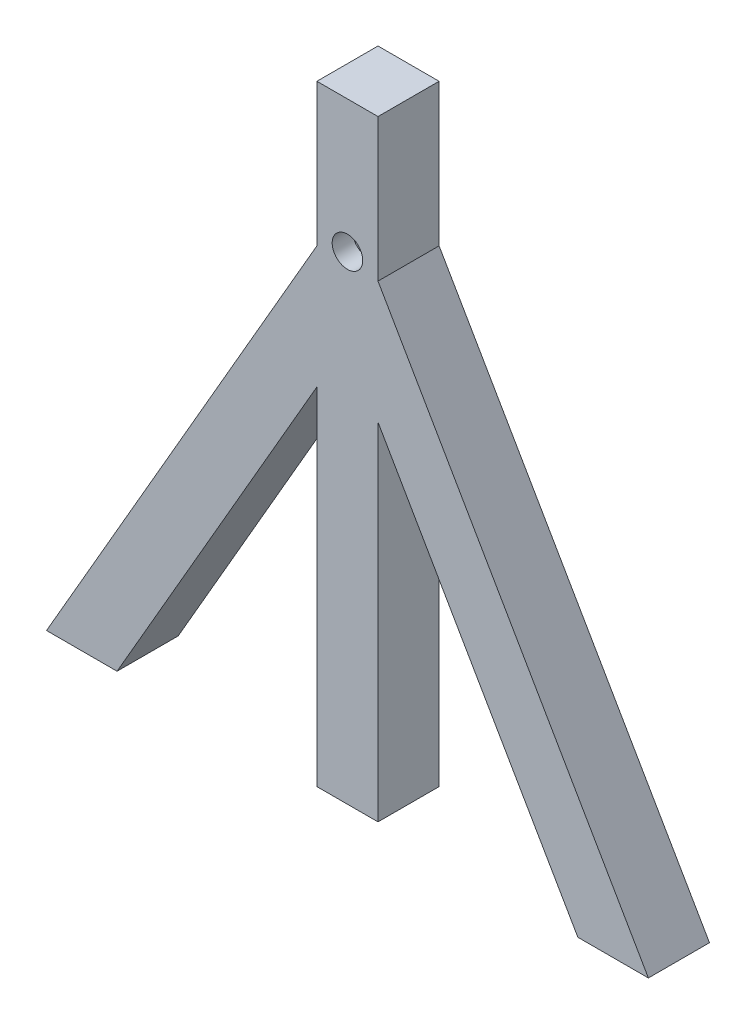
ISO-10303-21;
HEADER;
FILE_DESCRIPTION(('STEP AP214'),'2;1');
FILE_NAME('part.step','',(''),(''),'','','');
FILE_SCHEMA(('AUTOMOTIVE_DESIGN { 1 0 10303 214 1 1 1 1 }'));
ENDSEC;
DATA;
#1=APPLICATION_CONTEXT('core data for automotive mechanical design processes');
#2=APPLICATION_PROTOCOL_DEFINITION('international standard','automotive_design',2000,#1);
#3=PRODUCT_CONTEXT('',#1,'mechanical');
#4=PRODUCT('Part','Part','',(#3));
#5=PRODUCT_RELATED_PRODUCT_CATEGORY('part','',(#4));
#6=PRODUCT_DEFINITION_FORMATION('','',#4);
#7=PRODUCT_DEFINITION_CONTEXT('part definition',#1,'design');
#8=PRODUCT_DEFINITION('design','',#6,#7);
#9=PRODUCT_DEFINITION_SHAPE('','',#8);
#10=(LENGTH_UNIT() NAMED_UNIT(*) SI_UNIT(.MILLI.,.METRE.));
#11=(NAMED_UNIT(*) PLANE_ANGLE_UNIT() SI_UNIT($,.RADIAN.));
#12=(NAMED_UNIT(*) SI_UNIT($,.STERADIAN.) SOLID_ANGLE_UNIT());
#13=UNCERTAINTY_MEASURE_WITH_UNIT(LENGTH_MEASURE(1.E-05),#10,'distance_accuracy_value','');
#14=(GEOMETRIC_REPRESENTATION_CONTEXT(3) GLOBAL_UNCERTAINTY_ASSIGNED_CONTEXT((#13)) GLOBAL_UNIT_ASSIGNED_CONTEXT((#10,
#11,#12)) REPRESENTATION_CONTEXT('',''));
#15=CARTESIAN_POINT('',(0.,0.,0.));
#16=DIRECTION('',(0.,0.,1.));
#17=DIRECTION('',(1.,0.,0.));
#18=AXIS2_PLACEMENT_3D('',#15,#16,#17);
#19=CARTESIAN_POINT('',(14.9999999999999,80.0000000000009,30.));
#20=DIRECTION('',(-1.,0.,0.));
#21=DIRECTION('',(0.,-1.,0.));
#22=AXIS2_PLACEMENT_3D('',#19,#20,#21);
#23=PLANE('',#22);
#24=DIRECTION('',(0.,1.,0.));
#25=VECTOR('',#24,1.);
#26=CARTESIAN_POINT('',(14.9999999999999,80.0000000000009,0.));
#27=LINE('',#26,#25);
#28=CARTESIAN_POINT('',(14.9999999999999,80.0000000000009,0.));
#29=VERTEX_POINT('',#28);
#30=CARTESIAN_POINT('',(15.,150.,0.));
#31=VERTEX_POINT('',#30);
#32=EDGE_CURVE('E152',#29,#31,#27,.T.);
#33=ORIENTED_EDGE('',*,*,#32,.T.);
#34=DIRECTION('',(0.,0.,-1.));
#35=VECTOR('',#34,1.);
#36=CARTESIAN_POINT('',(15.,150.,30.));
#37=LINE('',#36,#35);
#38=CARTESIAN_POINT('',(15.,150.,30.));
#39=VERTEX_POINT('',#38);
#40=EDGE_CURVE('E11',#39,#31,#37,.T.);
#41=ORIENTED_EDGE('',*,*,#40,.F.);
#42=DIRECTION('',(0.,1.,0.));
#43=VECTOR('',#42,1.);
#44=CARTESIAN_POINT('',(14.9999999999999,80.0000000000009,30.));
#45=LINE('',#44,#43);
#46=CARTESIAN_POINT('',(14.9999999999999,80.0000000000009,30.));
#47=VERTEX_POINT('',#46);
#48=EDGE_CURVE('E175',#47,#39,#45,.T.);
#49=ORIENTED_EDGE('',*,*,#48,.F.);
#50=DIRECTION('',(0.,0.,-1.));
#51=VECTOR('',#50,1.);
#52=CARTESIAN_POINT('',(14.9999999999999,80.0000000000009,30.));
#53=LINE('',#52,#51);
#54=EDGE_CURVE('E148',#47,#29,#53,.T.);
#55=ORIENTED_EDGE('',*,*,#54,.T.);
#56=EDGE_LOOP('',(#33,#41,#49,#55));
#57=FACE_BOUND('',#56,.T.);
#58=ADVANCED_FACE('F32',(#57),#23,.F.);
#59=CARTESIAN_POINT('',(-15.,150.,30.));
#60=DIRECTION('',(0.,-1.,0.));
#61=DIRECTION('',(0.,0.,-1.));
#62=AXIS2_PLACEMENT_3D('',#59,#60,#61);
#63=PLANE('',#62);
#64=DIRECTION('',(-1.,0.,0.));
#65=VECTOR('',#64,1.);
#66=CARTESIAN_POINT('',(-15.,150.,0.));
#67=LINE('',#66,#65);
#68=CARTESIAN_POINT('',(-15.,150.,0.));
#69=VERTEX_POINT('',#68);
#70=EDGE_CURVE('E155',#31,#69,#67,.T.);
#71=ORIENTED_EDGE('',*,*,#70,.T.);
#72=DIRECTION('',(0.,0.,-1.));
#73=VECTOR('',#72,1.);
#74=CARTESIAN_POINT('',(-15.,150.,30.));
#75=LINE('',#74,#73);
#76=CARTESIAN_POINT('',(-15.,150.,30.));
#77=VERTEX_POINT('',#76);
#78=EDGE_CURVE('E40',#77,#69,#75,.T.);
#79=ORIENTED_EDGE('',*,*,#78,.F.);
#80=DIRECTION('',(-1.,0.,0.));
#81=VECTOR('',#80,1.);
#82=CARTESIAN_POINT('',(-15.,150.,30.));
#83=LINE('',#82,#81);
#84=EDGE_CURVE('E103',#39,#77,#83,.T.);
#85=ORIENTED_EDGE('',*,*,#84,.F.);
#86=ORIENTED_EDGE('',*,*,#40,.T.);
#87=EDGE_LOOP('',(#71,#79,#85,#86));
#88=FACE_BOUND('',#87,.T.);
#89=ADVANCED_FACE('F254',(#88),#63,.F.);
#90=CARTESIAN_POINT('',(-15.,80.0000000000009,30.));
#91=DIRECTION('',(1.,0.,0.));
#92=DIRECTION('',(0.,1.,0.));
#93=AXIS2_PLACEMENT_3D('',#90,#91,#92);
#94=PLANE('',#93);
#95=DIRECTION('',(0.,-1.,0.));
#96=VECTOR('',#95,1.);
#97=CARTESIAN_POINT('',(-15.,80.0000000000009,0.));
#98=LINE('',#97,#96);
#99=CARTESIAN_POINT('',(-15.,80.0000000000009,0.));
#100=VERTEX_POINT('',#99);
#101=EDGE_CURVE('E158',#69,#100,#98,.T.);
#102=ORIENTED_EDGE('',*,*,#101,.T.);
#103=DIRECTION('',(0.,0.,-1.));
#104=VECTOR('',#103,1.);
#105=CARTESIAN_POINT('',(-15.,80.0000000000009,30.));
#106=LINE('',#105,#104);
#107=CARTESIAN_POINT('',(-15.,80.0000000000009,30.));
#108=VERTEX_POINT('',#107);
#109=EDGE_CURVE('E194',#108,#100,#106,.T.);
#110=ORIENTED_EDGE('',*,*,#109,.F.);
#111=DIRECTION('',(0.,-1.,0.));
#112=VECTOR('',#111,1.);
#113=CARTESIAN_POINT('',(-15.,80.0000000000009,30.));
#114=LINE('',#113,#112);
#115=EDGE_CURVE('E202',#77,#108,#114,.T.);
#116=ORIENTED_EDGE('',*,*,#115,.F.);
#117=ORIENTED_EDGE('',*,*,#78,.T.);
#118=EDGE_LOOP('',(#102,#110,#116,#117));
#119=FACE_BOUND('',#118,.T.);
#120=ADVANCED_FACE('F200',(#119),#94,.F.);
#121=CARTESIAN_POINT('',(-147.790561913612,-150.,30.));
#122=DIRECTION('',(0.866025403784442,-0.499999999999995,0.));
#123=DIRECTION('',(0.499999999999995,0.866025403784442,0.));
#124=AXIS2_PLACEMENT_3D('',#121,#122,#123);
#125=PLANE('',#124);
#126=DIRECTION('',(-0.499999999999995,-0.866025403784442,0.));
#127=VECTOR('',#126,1.);
#128=CARTESIAN_POINT('',(-147.790561913612,-150.,0.));
#129=LINE('',#128,#127);
#130=CARTESIAN_POINT('',(-147.790561913612,-150.,0.));
#131=VERTEX_POINT('',#130);
#132=EDGE_CURVE('E160',#100,#131,#129,.T.);
#133=ORIENTED_EDGE('',*,*,#132,.T.);
#134=DIRECTION('',(0.,0.,-1.));
#135=VECTOR('',#134,1.);
#136=CARTESIAN_POINT('',(-147.790561913612,-150.,30.));
#137=LINE('',#136,#135);
#138=CARTESIAN_POINT('',(-147.790561913612,-150.,30.));
#139=VERTEX_POINT('',#138);
#140=EDGE_CURVE('E191',#139,#131,#137,.T.);
#141=ORIENTED_EDGE('',*,*,#140,.F.);
#142=DIRECTION('',(-0.499999999999995,-0.866025403784442,0.));
#143=VECTOR('',#142,1.);
#144=CARTESIAN_POINT('',(-147.790561913612,-150.,30.));
#145=LINE('',#144,#143);
#146=EDGE_CURVE('E220',#108,#139,#145,.T.);
#147=ORIENTED_EDGE('',*,*,#146,.F.);
#148=ORIENTED_EDGE('',*,*,#109,.T.);
#149=EDGE_LOOP('',(#133,#141,#147,#148));
#150=FACE_BOUND('',#149,.T.);
#151=ADVANCED_FACE('F211',(#150),#125,.F.);
#152=CARTESIAN_POINT('',(-113.149545762235,-150.,30.));
#153=DIRECTION('',(0.,1.,0.));
#154=DIRECTION('',(0.,0.,1.));
#155=AXIS2_PLACEMENT_3D('',#152,#153,#154);
#156=PLANE('',#155);
#157=DIRECTION('',(1.,0.,0.));
#158=VECTOR('',#157,1.);
#159=CARTESIAN_POINT('',(-113.149545762235,-150.,0.));
#160=LINE('',#159,#158);
#161=CARTESIAN_POINT('',(-113.149545762235,-150.,0.));
#162=VERTEX_POINT('',#161);
#163=EDGE_CURVE('E162',#131,#162,#160,.T.);
#164=ORIENTED_EDGE('',*,*,#163,.T.);
#165=DIRECTION('',(0.,0.,-1.));
#166=VECTOR('',#165,1.);
#167=CARTESIAN_POINT('',(-113.149545762235,-150.,30.));
#168=LINE('',#167,#166);
#169=CARTESIAN_POINT('',(-113.149545762235,-150.,30.));
#170=VERTEX_POINT('',#169);
#171=EDGE_CURVE('E188',#170,#162,#168,.T.);
#172=ORIENTED_EDGE('',*,*,#171,.F.);
#173=DIRECTION('',(1.,0.,0.));
#174=VECTOR('',#173,1.);
#175=CARTESIAN_POINT('',(-113.149545762235,-150.,30.));
#176=LINE('',#175,#174);
#177=EDGE_CURVE('E217',#139,#170,#176,.T.);
#178=ORIENTED_EDGE('',*,*,#177,.F.);
#179=ORIENTED_EDGE('',*,*,#140,.T.);
#180=EDGE_LOOP('',(#164,#172,#178,#179));
#181=FACE_BOUND('',#180,.T.);
#182=ADVANCED_FACE('F215',(#181),#156,.F.);
#183=CARTESIAN_POINT('',(-15.,20.0000000000002,30.));
#184=DIRECTION('',(-0.866025403784442,0.499999999999995,0.));
#185=DIRECTION('',(-0.499999999999995,-0.866025403784442,0.));
#186=AXIS2_PLACEMENT_3D('',#183,#184,#185);
#187=PLANE('',#186);
#188=DIRECTION('',(0.499999999999995,0.866025403784442,0.));
#189=VECTOR('',#188,1.);
#190=CARTESIAN_POINT('',(-15.,20.0000000000002,0.));
#191=LINE('',#190,#189);
#192=CARTESIAN_POINT('',(-15.,20.0000000000002,0.));
#193=VERTEX_POINT('',#192);
#194=EDGE_CURVE('E164',#162,#193,#191,.T.);
#195=ORIENTED_EDGE('',*,*,#194,.T.);
#196=DIRECTION('',(0.,0.,-1.));
#197=VECTOR('',#196,1.);
#198=CARTESIAN_POINT('',(-15.,20.0000000000002,30.));
#199=LINE('',#198,#197);
#200=CARTESIAN_POINT('',(-15.,20.0000000000002,30.));
#201=VERTEX_POINT('',#200);
#202=EDGE_CURVE('E185',#201,#193,#199,.T.);
#203=ORIENTED_EDGE('',*,*,#202,.F.);
#204=DIRECTION('',(0.499999999999995,0.866025403784442,0.));
#205=VECTOR('',#204,1.);
#206=CARTESIAN_POINT('',(-15.,20.0000000000002,30.));
#207=LINE('',#206,#205);
#208=EDGE_CURVE('E219',#170,#201,#207,.T.);
#209=ORIENTED_EDGE('',*,*,#208,.F.);
#210=ORIENTED_EDGE('',*,*,#171,.T.);
#211=EDGE_LOOP('',(#195,#203,#209,#210));
#212=FACE_BOUND('',#211,.T.);
#213=ADVANCED_FACE('F267',(#212),#187,.F.);
#214=CARTESIAN_POINT('',(-15.,-150.,30.));
#215=DIRECTION('',(1.,0.,0.));
#216=DIRECTION('',(0.,1.,0.));
#217=AXIS2_PLACEMENT_3D('',#214,#215,#216);
#218=PLANE('',#217);
#219=DIRECTION('',(0.,-1.,0.));
#220=VECTOR('',#219,1.);
#221=CARTESIAN_POINT('',(-15.,-150.,0.));
#222=LINE('',#221,#220);
#223=CARTESIAN_POINT('',(-15.,-150.,0.));
#224=VERTEX_POINT('',#223);
#225=EDGE_CURVE('E166',#193,#224,#222,.T.);
#226=ORIENTED_EDGE('',*,*,#225,.T.);
#227=DIRECTION('',(0.,0.,-1.));
#228=VECTOR('',#227,1.);
#229=CARTESIAN_POINT('',(-15.,-150.,30.));
#230=LINE('',#229,#228);
#231=CARTESIAN_POINT('',(-15.,-150.,30.));
#232=VERTEX_POINT('',#231);
#233=EDGE_CURVE('E182',#232,#224,#230,.T.);
#234=ORIENTED_EDGE('',*,*,#233,.F.);
#235=DIRECTION('',(0.,-1.,0.));
#236=VECTOR('',#235,1.);
#237=CARTESIAN_POINT('',(-15.,-150.,30.));
#238=LINE('',#237,#236);
#239=EDGE_CURVE('E222',#201,#232,#238,.T.);
#240=ORIENTED_EDGE('',*,*,#239,.F.);
#241=ORIENTED_EDGE('',*,*,#202,.T.);
#242=EDGE_LOOP('',(#226,#234,#240,#241));
#243=FACE_BOUND('',#242,.T.);
#244=ADVANCED_FACE('F270',(#243),#218,.F.);
#245=CARTESIAN_POINT('',(-15.,-150.,30.));
#246=DIRECTION('',(0.,1.,0.));
#247=DIRECTION('',(0.,0.,1.));
#248=AXIS2_PLACEMENT_3D('',#245,#246,#247);
#249=PLANE('',#248);
#250=DIRECTION('',(1.,0.,0.));
#251=VECTOR('',#250,1.);
#252=CARTESIAN_POINT('',(-15.,-150.,0.));
#253=LINE('',#252,#251);
#254=CARTESIAN_POINT('',(15.,-150.,0.));
#255=VERTEX_POINT('',#254);
#256=EDGE_CURVE('E168',#224,#255,#253,.T.);
#257=ORIENTED_EDGE('',*,*,#256,.T.);
#258=DIRECTION('',(0.,0.,-1.));
#259=VECTOR('',#258,1.);
#260=CARTESIAN_POINT('',(15.,-150.,30.));
#261=LINE('',#260,#259);
#262=CARTESIAN_POINT('',(15.,-150.,30.));
#263=VERTEX_POINT('',#262);
#264=EDGE_CURVE('E179',#263,#255,#261,.T.);
#265=ORIENTED_EDGE('',*,*,#264,.F.);
#266=DIRECTION('',(1.,0.,0.));
#267=VECTOR('',#266,1.);
#268=CARTESIAN_POINT('',(-15.,-150.,30.));
#269=LINE('',#268,#267);
#270=EDGE_CURVE('E228',#232,#263,#269,.T.);
#271=ORIENTED_EDGE('',*,*,#270,.F.);
#272=ORIENTED_EDGE('',*,*,#233,.T.);
#273=EDGE_LOOP('',(#257,#265,#271,#272));
#274=FACE_BOUND('',#273,.T.);
#275=ADVANCED_FACE('F234',(#274),#249,.F.);
#276=CARTESIAN_POINT('',(15.,-150.,30.));
#277=DIRECTION('',(-1.,0.,0.));
#278=DIRECTION('',(0.,-1.,0.));
#279=AXIS2_PLACEMENT_3D('',#276,#277,#278);
#280=PLANE('',#279);
#281=DIRECTION('',(0.,1.,0.));
#282=VECTOR('',#281,1.);
#283=CARTESIAN_POINT('',(15.,-150.,0.));
#284=LINE('',#283,#282);
#285=CARTESIAN_POINT('',(15.,20.0000000000002,0.));
#286=VERTEX_POINT('',#285);
#287=EDGE_CURVE('E170',#255,#286,#284,.T.);
#288=ORIENTED_EDGE('',*,*,#287,.T.);
#289=DIRECTION('',(0.,0.,-1.));
#290=VECTOR('',#289,1.);
#291=CARTESIAN_POINT('',(15.,20.0000000000002,30.));
#292=LINE('',#291,#290);
#293=CARTESIAN_POINT('',(15.,20.0000000000002,30.));
#294=VERTEX_POINT('',#293);
#295=EDGE_CURVE('E143',#294,#286,#292,.T.);
#296=ORIENTED_EDGE('',*,*,#295,.F.);
#297=DIRECTION('',(0.,1.,0.));
#298=VECTOR('',#297,1.);
#299=CARTESIAN_POINT('',(15.,-150.,30.));
#300=LINE('',#299,#298);
#301=EDGE_CURVE('E134',#263,#294,#300,.T.);
#302=ORIENTED_EDGE('',*,*,#301,.F.);
#303=ORIENTED_EDGE('',*,*,#264,.T.);
#304=EDGE_LOOP('',(#288,#296,#302,#303));
#305=FACE_BOUND('',#304,.T.);
#306=ADVANCED_FACE('F238',(#305),#280,.F.);
#307=CARTESIAN_POINT('',(15.,20.0000000000002,30.));
#308=DIRECTION('',(0.866025403784442,0.499999999999995,0.));
#309=DIRECTION('',(-0.499999999999995,0.866025403784442,0.));
#310=AXIS2_PLACEMENT_3D('',#307,#308,#309);
#311=PLANE('',#310);
#312=DIRECTION('',(0.499999999999995,-0.866025403784442,0.));
#313=VECTOR('',#312,1.);
#314=CARTESIAN_POINT('',(15.,20.0000000000002,0.));
#315=LINE('',#314,#313);
#316=CARTESIAN_POINT('',(113.149545762235,-150.,0.));
#317=VERTEX_POINT('',#316);
#318=EDGE_CURVE('E142',#286,#317,#315,.T.);
#319=ORIENTED_EDGE('',*,*,#318,.T.);
#320=DIRECTION('',(0.,0.,-1.));
#321=VECTOR('',#320,1.);
#322=CARTESIAN_POINT('',(113.149545762235,-150.,30.));
#323=LINE('',#322,#321);
#324=CARTESIAN_POINT('',(113.149545762235,-150.,30.));
#325=VERTEX_POINT('',#324);
#326=EDGE_CURVE('E139',#325,#317,#323,.T.);
#327=ORIENTED_EDGE('',*,*,#326,.F.);
#328=DIRECTION('',(0.499999999999995,-0.866025403784442,0.));
#329=VECTOR('',#328,1.);
#330=CARTESIAN_POINT('',(15.,20.0000000000002,30.));
#331=LINE('',#330,#329);
#332=EDGE_CURVE('E128',#294,#325,#331,.T.);
#333=ORIENTED_EDGE('',*,*,#332,.F.);
#334=ORIENTED_EDGE('',*,*,#295,.T.);
#335=EDGE_LOOP('',(#319,#327,#333,#334));
#336=FACE_BOUND('',#335,.T.);
#337=ADVANCED_FACE('F140',(#336),#311,.F.);
#338=CARTESIAN_POINT('',(113.149545762235,-150.,30.));
#339=DIRECTION('',(0.,1.,0.));
#340=DIRECTION('',(0.,0.,1.));
#341=AXIS2_PLACEMENT_3D('',#338,#339,#340);
#342=PLANE('',#341);
#343=DIRECTION('',(1.,0.,0.));
#344=VECTOR('',#343,1.);
#345=CARTESIAN_POINT('',(113.149545762235,-150.,0.));
#346=LINE('',#345,#344);
#347=CARTESIAN_POINT('',(147.790561913612,-150.,0.));
#348=VERTEX_POINT('',#347);
#349=EDGE_CURVE('E89',#317,#348,#346,.T.);
#350=ORIENTED_EDGE('',*,*,#349,.T.);
#351=DIRECTION('',(0.,0.,-1.));
#352=VECTOR('',#351,1.);
#353=CARTESIAN_POINT('',(147.790561913612,-150.,30.));
#354=LINE('',#353,#352);
#355=CARTESIAN_POINT('',(147.790561913612,-150.,30.));
#356=VERTEX_POINT('',#355);
#357=EDGE_CURVE('E144',#356,#348,#354,.T.);
#358=ORIENTED_EDGE('',*,*,#357,.F.);
#359=DIRECTION('',(1.,0.,0.));
#360=VECTOR('',#359,1.);
#361=CARTESIAN_POINT('',(113.149545762235,-150.,30.));
#362=LINE('',#361,#360);
#363=EDGE_CURVE('E132',#325,#356,#362,.T.);
#364=ORIENTED_EDGE('',*,*,#363,.F.);
#365=ORIENTED_EDGE('',*,*,#326,.T.);
#366=EDGE_LOOP('',(#350,#358,#364,#365));
#367=FACE_BOUND('',#366,.T.);
#368=ADVANCED_FACE('F146',(#367),#342,.F.);
#369=CARTESIAN_POINT('',(147.790561913612,-150.,30.));
#370=DIRECTION('',(-0.866025403784441,-0.499999999999995,0.));
#371=DIRECTION('',(0.499999999999995,-0.866025403784442,0.));
#372=AXIS2_PLACEMENT_3D('',#369,#370,#371);
#373=PLANE('',#372);
#374=DIRECTION('',(-0.499999999999995,0.866025403784442,0.));
#375=VECTOR('',#374,1.);
#376=CARTESIAN_POINT('',(147.790561913612,-150.,0.));
#377=LINE('',#376,#375);
#378=EDGE_CURVE('E95',#348,#29,#377,.T.);
#379=ORIENTED_EDGE('',*,*,#378,.T.);
#380=ORIENTED_EDGE('',*,*,#54,.F.);
#381=DIRECTION('',(-0.499999999999995,0.866025403784442,0.));
#382=VECTOR('',#381,1.);
#383=CARTESIAN_POINT('',(147.790561913612,-150.,30.));
#384=LINE('',#383,#382);
#385=EDGE_CURVE('E48',#356,#47,#384,.T.);
#386=ORIENTED_EDGE('',*,*,#385,.F.);
#387=ORIENTED_EDGE('',*,*,#357,.T.);
#388=EDGE_LOOP('',(#379,#380,#386,#387));
#389=FACE_BOUND('',#388,.T.);
#390=ADVANCED_FACE('F242',(#389),#373,.F.);
#391=CARTESIAN_POINT('',(0.,0.,30.));
#392=DIRECTION('',(0.,0.,-1.));
#393=DIRECTION('',(-1.,0.,0.));
#394=AXIS2_PLACEMENT_3D('',#391,#392,#393);
#395=PLANE('',#394);
#396=CARTESIAN_POINT('',(0.,85.0000000000001,30.));
#397=DIRECTION('',(0.,0.,1.));
#398=DIRECTION('',(1.,0.,0.));
#399=AXIS2_PLACEMENT_3D('',#396,#397,#398);
#400=CIRCLE('',#399,7.5);
#401=CARTESIAN_POINT('',(7.5,85.0000000000001,30.));
#402=VERTEX_POINT('',#401);
#403=EDGE_CURVE('E331',#402,#402,#400,.T.);
#404=ORIENTED_EDGE('',*,*,#403,.F.);
#405=EDGE_LOOP('',(#404));
#406=FACE_BOUND('',#405,.T.);
#407=ORIENTED_EDGE('',*,*,#48,.T.);
#408=ORIENTED_EDGE('',*,*,#84,.T.);
#409=ORIENTED_EDGE('',*,*,#115,.T.);
#410=ORIENTED_EDGE('',*,*,#146,.T.);
#411=ORIENTED_EDGE('',*,*,#177,.T.);
#412=ORIENTED_EDGE('',*,*,#208,.T.);
#413=ORIENTED_EDGE('',*,*,#239,.T.);
#414=ORIENTED_EDGE('',*,*,#270,.T.);
#415=ORIENTED_EDGE('',*,*,#301,.T.);
#416=ORIENTED_EDGE('',*,*,#332,.T.);
#417=ORIENTED_EDGE('',*,*,#363,.T.);
#418=ORIENTED_EDGE('',*,*,#385,.T.);
#419=EDGE_LOOP('',(#407,#408,#409,#410,#411,#412,#413,#414,#415,#416,#417,#418));
#420=FACE_BOUND('',#419,.T.);
#421=ADVANCED_FACE('F130',(#406,#420),#395,.F.);
#422=CARTESIAN_POINT('',(0.,0.,0.));
#423=DIRECTION('',(0.,0.,-1.));
#424=DIRECTION('',(-1.,0.,0.));
#425=AXIS2_PLACEMENT_3D('',#422,#423,#424);
#426=PLANE('',#425);
#427=ORIENTED_EDGE('',*,*,#32,.F.);
#428=ORIENTED_EDGE('',*,*,#378,.F.);
#429=ORIENTED_EDGE('',*,*,#349,.F.);
#430=ORIENTED_EDGE('',*,*,#318,.F.);
#431=ORIENTED_EDGE('',*,*,#287,.F.);
#432=ORIENTED_EDGE('',*,*,#256,.F.);
#433=ORIENTED_EDGE('',*,*,#225,.F.);
#434=ORIENTED_EDGE('',*,*,#194,.F.);
#435=ORIENTED_EDGE('',*,*,#163,.F.);
#436=ORIENTED_EDGE('',*,*,#132,.F.);
#437=ORIENTED_EDGE('',*,*,#101,.F.);
#438=ORIENTED_EDGE('',*,*,#70,.F.);
#439=EDGE_LOOP('',(#427,#428,#429,#430,#431,#432,#433,#434,#435,#436,#437,#438));
#440=FACE_BOUND('',#439,.T.);
#441=ADVANCED_FACE('F206',(#440),#426,.T.);
#442=CARTESIAN_POINT('',(0.,85.0000000000001,20.));
#443=DIRECTION('',(0.,0.,1.));
#444=DIRECTION('',(1.,0.,0.));
#445=AXIS2_PLACEMENT_3D('',#442,#443,#444);
#446=CYLINDRICAL_SURFACE('',#445,7.5);
#447=CARTESIAN_POINT('',(0.,85.0000000000001,20.));
#448=DIRECTION('',(0.,0.,1.));
#449=DIRECTION('',(1.,0.,0.));
#450=AXIS2_PLACEMENT_3D('',#447,#448,#449);
#451=CIRCLE('',#450,7.5);
#452=CARTESIAN_POINT('',(7.5,85.0000000000001,20.));
#453=VERTEX_POINT('',#452);
#454=EDGE_CURVE('E156',#453,#453,#451,.T.);
#455=ORIENTED_EDGE('',*,*,#454,.F.);
#456=EDGE_LOOP('',(#455));
#457=FACE_BOUND('',#456,.T.);
#458=ORIENTED_EDGE('',*,*,#403,.T.);
#459=EDGE_LOOP('',(#458));
#460=FACE_BOUND('',#459,.T.);
#461=ADVANCED_FACE('F302',(#457,#460),#446,.F.);
#462=CARTESIAN_POINT('',(0.,85.0000000000001,20.));
#463=DIRECTION('',(0.,0.,1.));
#464=DIRECTION('',(1.,0.,0.));
#465=AXIS2_PLACEMENT_3D('',#462,#463,#464);
#466=PLANE('',#465);
#467=ORIENTED_EDGE('',*,*,#454,.T.);
#468=EDGE_LOOP('',(#467));
#469=FACE_BOUND('',#468,.T.);
#470=ADVANCED_FACE('F315',(#469),#466,.T.);
#471=CLOSED_SHELL('',(#58,#89,#120,#151,#182,#213,#244,#275,#306,#337,#368,#390,#421,#441,#461,#470));
#472=MANIFOLD_SOLID_BREP('B2',#471);
#473=ADVANCED_BREP_SHAPE_REPRESENTATION('',(#18,#472),#14);
#474=SHAPE_DEFINITION_REPRESENTATION(#9,#473);
ENDSEC;
END-ISO-10303-21;
